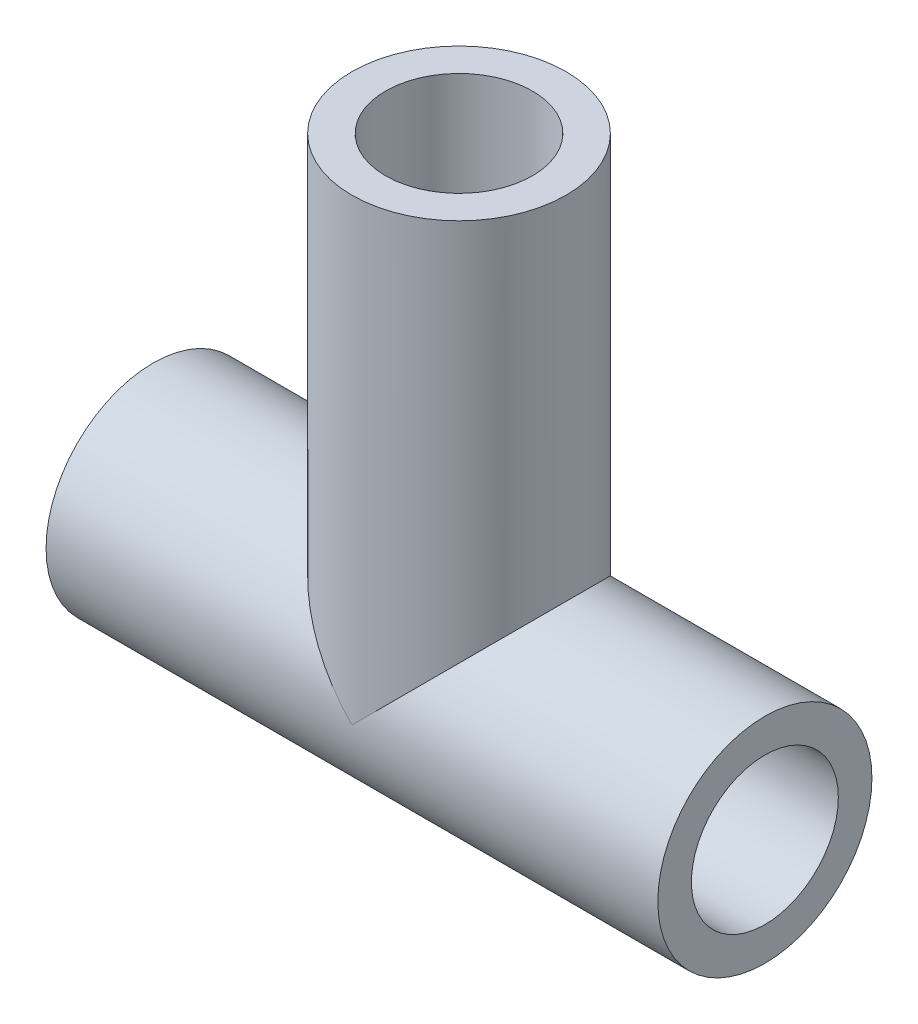
ISO-10303-21;
HEADER;
FILE_DESCRIPTION(('STEP AP214'),'2;1');
FILE_NAME('part.step','',(''),(''),'','','');
FILE_SCHEMA(('AUTOMOTIVE_DESIGN { 1 0 10303 214 1 1 1 1 }'));
ENDSEC;
DATA;
#1=APPLICATION_CONTEXT('core data for automotive mechanical design processes');
#2=APPLICATION_PROTOCOL_DEFINITION('international standard','automotive_design',2000,#1);
#3=PRODUCT_CONTEXT('',#1,'mechanical');
#4=PRODUCT('Part','Part','',(#3));
#5=PRODUCT_RELATED_PRODUCT_CATEGORY('part','',(#4));
#6=PRODUCT_DEFINITION_FORMATION('','',#4);
#7=PRODUCT_DEFINITION_CONTEXT('part definition',#1,'design');
#8=PRODUCT_DEFINITION('design','',#6,#7);
#9=PRODUCT_DEFINITION_SHAPE('','',#8);
#10=(LENGTH_UNIT() NAMED_UNIT(*) SI_UNIT(.MILLI.,.METRE.));
#11=(NAMED_UNIT(*) PLANE_ANGLE_UNIT() SI_UNIT($,.RADIAN.));
#12=(NAMED_UNIT(*) SI_UNIT($,.STERADIAN.) SOLID_ANGLE_UNIT());
#13=UNCERTAINTY_MEASURE_WITH_UNIT(LENGTH_MEASURE(1.E-05),#10,'distance_accuracy_value','');
#14=(GEOMETRIC_REPRESENTATION_CONTEXT(3) GLOBAL_UNCERTAINTY_ASSIGNED_CONTEXT((#13)) GLOBAL_UNIT_ASSIGNED_CONTEXT((#10,
#11,#12)) REPRESENTATION_CONTEXT('',''));
#15=CARTESIAN_POINT('',(0.,0.,0.));
#16=DIRECTION('',(0.,0.,1.));
#17=DIRECTION('',(1.,0.,0.));
#18=AXIS2_PLACEMENT_3D('',#15,#16,#17);
#19=CARTESIAN_POINT('',(25.4,0.,0.));
#20=DIRECTION('',(-1.,0.,0.));
#21=DIRECTION('',(0.,0.,1.));
#22=AXIS2_PLACEMENT_3D('',#19,#20,#21);
#23=CYLINDRICAL_SURFACE('',#22,4.445);
#24=CARTESIAN_POINT('',(0.,0.,0.));
#25=DIRECTION('',(1.,0.,0.));
#26=DIRECTION('',(0.,0.,-1.));
#27=AXIS2_PLACEMENT_3D('',#24,#25,#26);
#28=CIRCLE('',#27,4.445);
#29=CARTESIAN_POINT('',(0.,0.,-4.445));
#30=VERTEX_POINT('',#29);
#31=EDGE_CURVE('E89',#30,#30,#28,.T.);
#32=ORIENTED_EDGE('',*,*,#31,.T.);
#33=EDGE_LOOP('',(#32));
#34=FACE_BOUND('',#33,.T.);
#35=CARTESIAN_POINT('',(25.4,0.,0.));
#36=DIRECTION('',(1.,0.,0.));
#37=DIRECTION('',(0.,0.,-1.));
#38=AXIS2_PLACEMENT_3D('',#35,#36,#37);
#39=CIRCLE('',#38,4.445);
#40=CARTESIAN_POINT('',(25.4,0.,-4.445));
#41=VERTEX_POINT('',#40);
#42=EDGE_CURVE('E90',#41,#41,#39,.T.);
#43=ORIENTED_EDGE('',*,*,#42,.F.);
#44=EDGE_LOOP('',(#43));
#45=FACE_BOUND('',#44,.T.);
#46=CARTESIAN_POINT('',(12.7,0.,0.));
#47=DIRECTION('',(-0.707106781186548,-0.707106781186547,0.));
#48=DIRECTION('',(-0.707106781186548,0.707106781186547,0.));
#49=AXIS2_PLACEMENT_3D('',#46,#47,#48);
#50=ELLIPSE('',#49,6.28617928474841,4.445);
#51=CARTESIAN_POINT('',(12.7,0.,-4.445));
#52=VERTEX_POINT('',#51);
#53=CARTESIAN_POINT('',(12.7,0.,4.445));
#54=VERTEX_POINT('',#53);
#55=EDGE_CURVE('E11',#52,#54,#50,.F.);
#56=ORIENTED_EDGE('',*,*,#55,.F.);
#57=CARTESIAN_POINT('',(12.7,0.,0.));
#58=DIRECTION('',(-0.707106781186548,0.707106781186547,0.));
#59=DIRECTION('',(-0.707106781186548,-0.707106781186547,0.));
#60=AXIS2_PLACEMENT_3D('',#57,#58,#59);
#61=ELLIPSE('',#60,6.28617928474841,4.445);
#62=EDGE_CURVE('E47',#54,#52,#61,.T.);
#63=ORIENTED_EDGE('',*,*,#62,.F.);
#64=EDGE_LOOP('',(#56,#63));
#65=FACE_BOUND('',#64,.T.);
#66=ADVANCED_FACE('F39',(#34,#45,#65),#23,.T.);
#67=CARTESIAN_POINT('',(25.4,0.,0.));
#68=DIRECTION('',(1.,0.,0.));
#69=DIRECTION('',(0.,0.,-1.));
#70=AXIS2_PLACEMENT_3D('',#67,#68,#69);
#71=PLANE('',#70);
#72=CARTESIAN_POINT('',(25.4,0.,0.));
#73=DIRECTION('',(1.,0.,0.));
#74=DIRECTION('',(0.,0.,-1.));
#75=AXIS2_PLACEMENT_3D('',#72,#73,#74);
#76=CIRCLE('',#75,3.05);
#77=CARTESIAN_POINT('',(25.4,0.,-3.05));
#78=VERTEX_POINT('',#77);
#79=EDGE_CURVE('E75',#78,#78,#76,.T.);
#80=ORIENTED_EDGE('',*,*,#79,.F.);
#81=EDGE_LOOP('',(#80));
#82=FACE_BOUND('',#81,.T.);
#83=ORIENTED_EDGE('',*,*,#42,.T.);
#84=EDGE_LOOP('',(#83));
#85=FACE_BOUND('',#84,.T.);
#86=ADVANCED_FACE('F100',(#82,#85),#71,.T.);
#87=CARTESIAN_POINT('',(0.,0.,0.));
#88=DIRECTION('',(1.,0.,0.));
#89=DIRECTION('',(0.,0.,-1.));
#90=AXIS2_PLACEMENT_3D('',#87,#88,#89);
#91=PLANE('',#90);
#92=CARTESIAN_POINT('',(0.,0.,0.));
#93=DIRECTION('',(1.,0.,0.));
#94=DIRECTION('',(0.,0.,-1.));
#95=AXIS2_PLACEMENT_3D('',#92,#93,#94);
#96=CIRCLE('',#95,3.05);
#97=CARTESIAN_POINT('',(0.,0.,-3.05));
#98=VERTEX_POINT('',#97);
#99=EDGE_CURVE('E78',#98,#98,#96,.T.);
#100=ORIENTED_EDGE('',*,*,#99,.T.);
#101=EDGE_LOOP('',(#100));
#102=FACE_BOUND('',#101,.T.);
#103=ORIENTED_EDGE('',*,*,#31,.F.);
#104=EDGE_LOOP('',(#103));
#105=FACE_BOUND('',#104,.T.);
#106=ADVANCED_FACE('F105',(#102,#105),#91,.F.);
#107=CARTESIAN_POINT('',(12.7,19.05,0.));
#108=DIRECTION('',(0.,-1.,0.));
#109=DIRECTION('',(0.,0.,-1.));
#110=AXIS2_PLACEMENT_3D('',#107,#108,#109);
#111=CYLINDRICAL_SURFACE('',#110,4.445);
#112=CARTESIAN_POINT('',(12.7,19.05,0.));
#113=DIRECTION('',(0.,1.,0.));
#114=DIRECTION('',(0.,0.,1.));
#115=AXIS2_PLACEMENT_3D('',#112,#113,#114);
#116=CIRCLE('',#115,4.445);
#117=CARTESIAN_POINT('',(12.7,19.05,4.445));
#118=VERTEX_POINT('',#117);
#119=EDGE_CURVE('E82',#118,#118,#116,.T.);
#120=ORIENTED_EDGE('',*,*,#119,.F.);
#121=EDGE_LOOP('',(#120));
#122=FACE_BOUND('',#121,.T.);
#123=ORIENTED_EDGE('',*,*,#62,.T.);
#124=ORIENTED_EDGE('',*,*,#55,.T.);
#125=EDGE_LOOP('',(#123,#124));
#126=FACE_BOUND('',#125,.T.);
#127=ADVANCED_FACE('F98',(#122,#126),#111,.T.);
#128=CARTESIAN_POINT('',(12.7,19.05,0.));
#129=DIRECTION('',(0.,1.,0.));
#130=DIRECTION('',(0.,0.,1.));
#131=AXIS2_PLACEMENT_3D('',#128,#129,#130);
#132=PLANE('',#131);
#133=CARTESIAN_POINT('',(12.7,19.05,0.));
#134=DIRECTION('',(0.,1.,0.));
#135=DIRECTION('',(0.,0.,1.));
#136=AXIS2_PLACEMENT_3D('',#133,#134,#135);
#137=CIRCLE('',#136,3.05);
#138=CARTESIAN_POINT('',(12.7,19.05,3.05));
#139=VERTEX_POINT('',#138);
#140=EDGE_CURVE('E71',#139,#139,#137,.T.);
#141=ORIENTED_EDGE('',*,*,#140,.F.);
#142=EDGE_LOOP('',(#141));
#143=FACE_BOUND('',#142,.T.);
#144=ORIENTED_EDGE('',*,*,#119,.T.);
#145=EDGE_LOOP('',(#144));
#146=FACE_BOUND('',#145,.T.);
#147=ADVANCED_FACE('F118',(#143,#146),#132,.T.);
#148=CARTESIAN_POINT('',(0.,0.,0.));
#149=DIRECTION('',(1.,0.,0.));
#150=DIRECTION('',(0.,0.,-1.));
#151=AXIS2_PLACEMENT_3D('',#148,#149,#150);
#152=CYLINDRICAL_SURFACE('',#151,3.05);
#153=CARTESIAN_POINT('',(12.7,0.,0.));
#154=DIRECTION('',(-0.707106781186547,0.707106781186547,0.));
#155=DIRECTION('',(0.707106781186547,0.707106781186547,0.));
#156=AXIS2_PLACEMENT_3D('',#153,#154,#155);
#157=ELLIPSE('',#156,4.31335136523794,3.05);
#158=CARTESIAN_POINT('',(12.7,0.,-3.05));
#159=VERTEX_POINT('',#158);
#160=CARTESIAN_POINT('',(12.7,0.,3.05));
#161=VERTEX_POINT('',#160);
#162=EDGE_CURVE('E63',#159,#161,#157,.F.);
#163=ORIENTED_EDGE('',*,*,#162,.F.);
#164=CARTESIAN_POINT('',(12.7,0.,0.));
#165=DIRECTION('',(0.707106781186547,0.707106781186547,0.));
#166=DIRECTION('',(-0.707106781186547,0.707106781186547,0.));
#167=AXIS2_PLACEMENT_3D('',#164,#165,#166);
#168=ELLIPSE('',#167,4.31335136523794,3.05);
#169=EDGE_CURVE('E53',#161,#159,#168,.F.);
#170=ORIENTED_EDGE('',*,*,#169,.F.);
#171=EDGE_LOOP('',(#163,#170));
#172=FACE_BOUND('',#171,.T.);
#173=ORIENTED_EDGE('',*,*,#99,.F.);
#174=EDGE_LOOP('',(#173));
#175=FACE_BOUND('',#174,.T.);
#176=ORIENTED_EDGE('',*,*,#79,.T.);
#177=EDGE_LOOP('',(#176));
#178=FACE_BOUND('',#177,.T.);
#179=ADVANCED_FACE('F68',(#172,#175,#178),#152,.F.);
#180=CARTESIAN_POINT('',(12.7,-4.446,0.));
#181=DIRECTION('',(0.,1.,0.));
#182=DIRECTION('',(0.,0.,1.));
#183=AXIS2_PLACEMENT_3D('',#180,#181,#182);
#184=CYLINDRICAL_SURFACE('',#183,3.05);
#185=ORIENTED_EDGE('',*,*,#140,.T.);
#186=EDGE_LOOP('',(#185));
#187=FACE_BOUND('',#186,.T.);
#188=ORIENTED_EDGE('',*,*,#169,.T.);
#189=ORIENTED_EDGE('',*,*,#162,.T.);
#190=EDGE_LOOP('',(#188,#189));
#191=FACE_BOUND('',#190,.T.);
#192=ADVANCED_FACE('F64',(#187,#191),#184,.F.);
#193=CLOSED_SHELL('',(#66,#86,#106,#127,#147,#179,#192));
#194=MANIFOLD_SOLID_BREP('B2',#193);
#195=ADVANCED_BREP_SHAPE_REPRESENTATION('',(#18,#194),#14);
#196=SHAPE_DEFINITION_REPRESENTATION(#9,#195);
ENDSEC;
END-ISO-10303-21;
